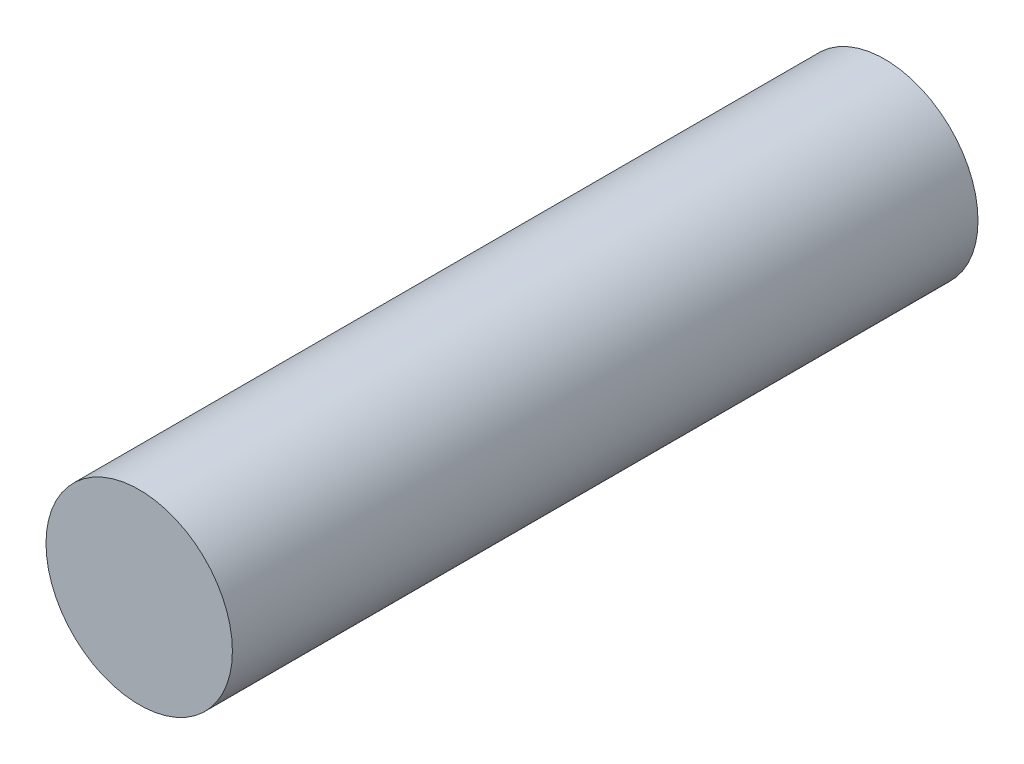
ISO-10303-21;
HEADER;
FILE_DESCRIPTION(('STEP AP214'),'2;1');
FILE_NAME('part.step','',(''),(''),'','','');
FILE_SCHEMA(('AUTOMOTIVE_DESIGN { 1 0 10303 214 1 1 1 1 }'));
ENDSEC;
DATA;
#1=APPLICATION_CONTEXT('core data for automotive mechanical design processes');
#2=APPLICATION_PROTOCOL_DEFINITION('international standard','automotive_design',2000,#1);
#3=PRODUCT_CONTEXT('',#1,'mechanical');
#4=PRODUCT('Part','Part','',(#3));
#5=PRODUCT_RELATED_PRODUCT_CATEGORY('part','',(#4));
#6=PRODUCT_DEFINITION_FORMATION('','',#4);
#7=PRODUCT_DEFINITION_CONTEXT('part definition',#1,'design');
#8=PRODUCT_DEFINITION('design','',#6,#7);
#9=PRODUCT_DEFINITION_SHAPE('','',#8);
#10=(LENGTH_UNIT() NAMED_UNIT(*) SI_UNIT(.MILLI.,.METRE.));
#11=(NAMED_UNIT(*) PLANE_ANGLE_UNIT() SI_UNIT($,.RADIAN.));
#12=(NAMED_UNIT(*) SI_UNIT($,.STERADIAN.) SOLID_ANGLE_UNIT());
#13=UNCERTAINTY_MEASURE_WITH_UNIT(LENGTH_MEASURE(1.E-05),#10,'distance_accuracy_value','');
#14=(GEOMETRIC_REPRESENTATION_CONTEXT(3) GLOBAL_UNCERTAINTY_ASSIGNED_CONTEXT((#13)) GLOBAL_UNIT_ASSIGNED_CONTEXT((#10,
#11,#12)) REPRESENTATION_CONTEXT('',''));
#15=CARTESIAN_POINT('',(0.,0.,0.));
#16=DIRECTION('',(0.,0.,1.));
#17=DIRECTION('',(1.,0.,0.));
#18=AXIS2_PLACEMENT_3D('',#15,#16,#17);
#19=CARTESIAN_POINT('',(-9.46203365401598,6.02129414346472,11.));
#20=DIRECTION('',(0.,0.,-1.));
#21=DIRECTION('',(-1.,0.,0.));
#22=AXIS2_PLACEMENT_3D('',#19,#20,#21);
#23=CYLINDRICAL_SURFACE('',#22,1.375);
#24=CARTESIAN_POINT('',(-9.46203365401598,6.02129414346472,11.));
#25=DIRECTION('',(0.,0.,1.));
#26=DIRECTION('',(1.,0.,0.));
#27=AXIS2_PLACEMENT_3D('',#24,#25,#26);
#28=CIRCLE('',#27,1.375);
#29=CARTESIAN_POINT('',(-8.08703365401598,6.02129414346472,11.));
#30=VERTEX_POINT('',#29);
#31=EDGE_CURVE('E12',#30,#30,#28,.T.);
#32=ORIENTED_EDGE('',*,*,#31,.F.);
#33=EDGE_LOOP('',(#32));
#34=FACE_BOUND('',#33,.T.);
#35=CARTESIAN_POINT('',(-9.46203365401598,6.02129414346472,0.));
#36=DIRECTION('',(0.,0.,1.));
#37=DIRECTION('',(1.,0.,0.));
#38=AXIS2_PLACEMENT_3D('',#35,#36,#37);
#39=CIRCLE('',#38,1.375);
#40=CARTESIAN_POINT('',(-8.08703365401598,6.02129414346472,0.));
#41=VERTEX_POINT('',#40);
#42=EDGE_CURVE('E43',#41,#41,#39,.T.);
#43=ORIENTED_EDGE('',*,*,#42,.T.);
#44=EDGE_LOOP('',(#43));
#45=FACE_BOUND('',#44,.T.);
#46=ADVANCED_FACE('F40',(#34,#45),#23,.T.);
#47=CARTESIAN_POINT('',(-9.46203365401598,6.02129414346472,11.));
#48=DIRECTION('',(0.,0.,1.));
#49=DIRECTION('',(1.,0.,0.));
#50=AXIS2_PLACEMENT_3D('',#47,#48,#49);
#51=PLANE('',#50);
#52=ORIENTED_EDGE('',*,*,#31,.T.);
#53=EDGE_LOOP('',(#52));
#54=FACE_BOUND('',#53,.T.);
#55=ADVANCED_FACE('F55',(#54),#51,.T.);
#56=CARTESIAN_POINT('',(-9.46203365401598,6.02129414346472,0.));
#57=DIRECTION('',(0.,0.,1.));
#58=DIRECTION('',(1.,0.,0.));
#59=AXIS2_PLACEMENT_3D('',#56,#57,#58);
#60=PLANE('',#59);
#61=ORIENTED_EDGE('',*,*,#42,.F.);
#62=EDGE_LOOP('',(#61));
#63=FACE_BOUND('',#62,.T.);
#64=ADVANCED_FACE('F53',(#63),#60,.F.);
#65=CLOSED_SHELL('',(#46,#55,#64));
#66=MANIFOLD_SOLID_BREP('B2',#65);
#67=ADVANCED_BREP_SHAPE_REPRESENTATION('',(#18,#66),#14);
#68=SHAPE_DEFINITION_REPRESENTATION(#9,#67);
ENDSEC;
END-ISO-10303-21;
